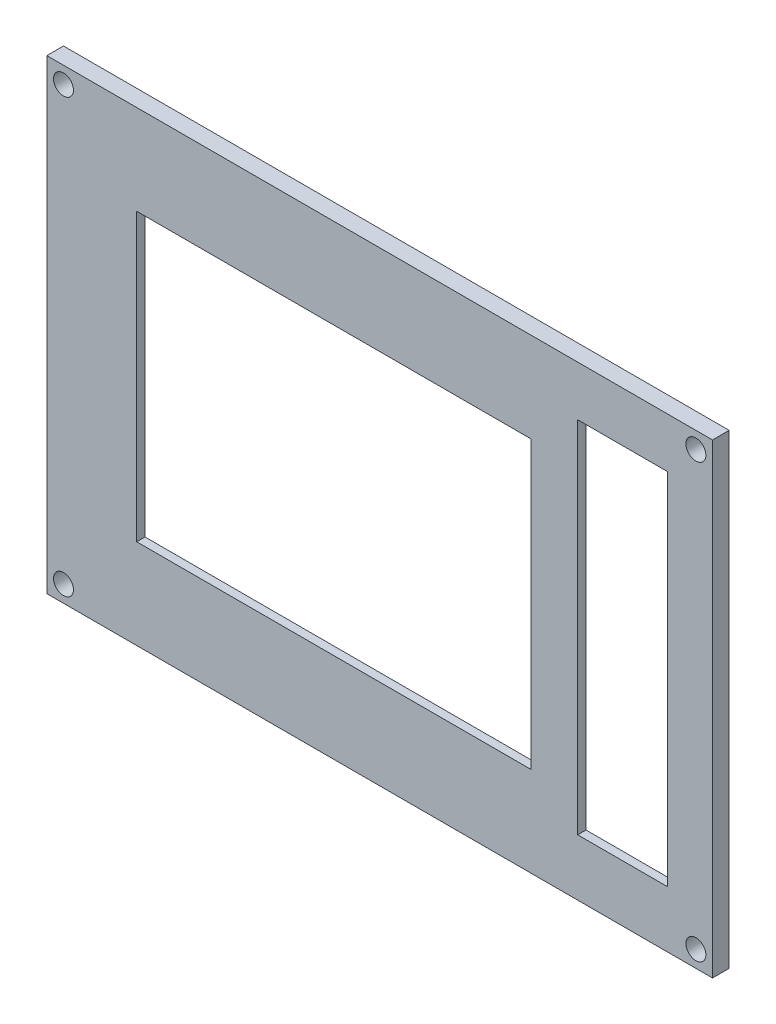
ISO-10303-21;
HEADER;
FILE_DESCRIPTION(('STEP AP214'),'2;1');
FILE_NAME('part.step','',(''),(''),'','','');
FILE_SCHEMA(('AUTOMOTIVE_DESIGN { 1 0 10303 214 1 1 1 1 }'));
ENDSEC;
DATA;
#1=APPLICATION_CONTEXT('core data for automotive mechanical design processes');
#2=APPLICATION_PROTOCOL_DEFINITION('international standard','automotive_design',2000,#1);
#3=PRODUCT_CONTEXT('',#1,'mechanical');
#4=PRODUCT('Part','Part','',(#3));
#5=PRODUCT_RELATED_PRODUCT_CATEGORY('part','',(#4));
#6=PRODUCT_DEFINITION_FORMATION('','',#4);
#7=PRODUCT_DEFINITION_CONTEXT('part definition',#1,'design');
#8=PRODUCT_DEFINITION('design','',#6,#7);
#9=PRODUCT_DEFINITION_SHAPE('','',#8);
#10=(LENGTH_UNIT() NAMED_UNIT(*) SI_UNIT(.MILLI.,.METRE.));
#11=(NAMED_UNIT(*) PLANE_ANGLE_UNIT() SI_UNIT($,.RADIAN.));
#12=(NAMED_UNIT(*) SI_UNIT($,.STERADIAN.) SOLID_ANGLE_UNIT());
#13=UNCERTAINTY_MEASURE_WITH_UNIT(LENGTH_MEASURE(1.E-05),#10,'distance_accuracy_value','');
#14=(GEOMETRIC_REPRESENTATION_CONTEXT(3) GLOBAL_UNCERTAINTY_ASSIGNED_CONTEXT((#13)) GLOBAL_UNIT_ASSIGNED_CONTEXT((#10,
#11,#12)) REPRESENTATION_CONTEXT('',''));
#15=CARTESIAN_POINT('',(0.,0.,0.));
#16=DIRECTION('',(0.,0.,1.));
#17=DIRECTION('',(1.,0.,0.));
#18=AXIS2_PLACEMENT_3D('',#15,#16,#17);
#19=CARTESIAN_POINT('',(0.,51.5,-1.25));
#20=DIRECTION('',(0.,-1.,0.));
#21=DIRECTION('',(0.,0.,-1.));
#22=AXIS2_PLACEMENT_3D('',#19,#20,#21);
#23=PLANE('',#22);
#24=DIRECTION('',(1.,0.,0.));
#25=VECTOR('',#24,1.);
#26=CARTESIAN_POINT('',(0.,51.5,0.));
#27=LINE('',#26,#25);
#28=CARTESIAN_POINT('',(8.5,51.5,0.));
#29=VERTEX_POINT('',#28);
#30=CARTESIAN_POINT('',(67.75,51.5,0.));
#31=VERTEX_POINT('',#30);
#32=EDGE_CURVE('E158',#29,#31,#27,.T.);
#33=ORIENTED_EDGE('',*,*,#32,.F.);
#34=DIRECTION('',(0.,0.,1.));
#35=VECTOR('',#34,1.);
#36=CARTESIAN_POINT('',(8.5,51.5,-1.25));
#37=LINE('',#36,#35);
#38=CARTESIAN_POINT('',(8.5,51.5,-1.25));
#39=VERTEX_POINT('',#38);
#40=EDGE_CURVE('E11',#39,#29,#37,.T.);
#41=ORIENTED_EDGE('',*,*,#40,.F.);
#42=DIRECTION('',(1.,0.,0.));
#43=VECTOR('',#42,1.);
#44=CARTESIAN_POINT('',(0.,51.5,-1.25));
#45=LINE('',#44,#43);
#46=CARTESIAN_POINT('',(67.75,51.5,-1.25));
#47=VERTEX_POINT('',#46);
#48=EDGE_CURVE('E139',#39,#47,#45,.T.);
#49=ORIENTED_EDGE('',*,*,#48,.T.);
#50=DIRECTION('',(0.,0.,1.));
#51=VECTOR('',#50,1.);
#52=CARTESIAN_POINT('',(67.75,51.5,-1.25));
#53=LINE('',#52,#51);
#54=EDGE_CURVE('E136',#47,#31,#53,.T.);
#55=ORIENTED_EDGE('',*,*,#54,.T.);
#56=EDGE_LOOP('',(#33,#41,#49,#55));
#57=FACE_BOUND('',#56,.T.);
#58=ADVANCED_FACE('F35',(#57),#23,.T.);
#59=CARTESIAN_POINT('',(8.50000000000001,0.,-1.25));
#60=DIRECTION('',(-1.,0.,0.));
#61=DIRECTION('',(0.,-1.,0.));
#62=AXIS2_PLACEMENT_3D('',#59,#60,#61);
#63=PLANE('',#62);
#64=DIRECTION('',(0.,-1.,0.));
#65=VECTOR('',#64,1.);
#66=CARTESIAN_POINT('',(8.50000000000001,0.,0.));
#67=LINE('',#66,#65);
#68=CARTESIAN_POINT('',(8.50000000000001,8.5,0.));
#69=VERTEX_POINT('',#68);
#70=EDGE_CURVE('E164',#29,#69,#67,.T.);
#71=ORIENTED_EDGE('',*,*,#70,.T.);
#72=DIRECTION('',(0.,0.,1.));
#73=VECTOR('',#72,1.);
#74=CARTESIAN_POINT('',(8.50000000000001,8.5,-1.25));
#75=LINE('',#74,#73);
#76=CARTESIAN_POINT('',(8.50000000000001,8.5,-1.25));
#77=VERTEX_POINT('',#76);
#78=EDGE_CURVE('E45',#77,#69,#75,.T.);
#79=ORIENTED_EDGE('',*,*,#78,.F.);
#80=DIRECTION('',(0.,-1.,0.));
#81=VECTOR('',#80,1.);
#82=CARTESIAN_POINT('',(8.50000000000001,0.,-1.25));
#83=LINE('',#82,#81);
#84=EDGE_CURVE('E128',#39,#77,#83,.T.);
#85=ORIENTED_EDGE('',*,*,#84,.F.);
#86=ORIENTED_EDGE('',*,*,#40,.T.);
#87=EDGE_LOOP('',(#71,#79,#85,#86));
#88=FACE_BOUND('',#87,.T.);
#89=ADVANCED_FACE('F247',(#88),#63,.F.);
#90=CARTESIAN_POINT('',(0.,8.5,-1.25));
#91=DIRECTION('',(0.,-1.,0.));
#92=DIRECTION('',(0.,0.,-1.));
#93=AXIS2_PLACEMENT_3D('',#90,#91,#92);
#94=PLANE('',#93);
#95=DIRECTION('',(1.,0.,0.));
#96=VECTOR('',#95,1.);
#97=CARTESIAN_POINT('',(0.,8.5,0.));
#98=LINE('',#97,#96);
#99=CARTESIAN_POINT('',(67.75,8.5,0.));
#100=VERTEX_POINT('',#99);
#101=EDGE_CURVE('E83',#69,#100,#98,.T.);
#102=ORIENTED_EDGE('',*,*,#101,.T.);
#103=DIRECTION('',(0.,0.,1.));
#104=VECTOR('',#103,1.);
#105=CARTESIAN_POINT('',(67.75,8.5,-1.25));
#106=LINE('',#105,#104);
#107=CARTESIAN_POINT('',(67.75,8.5,-1.25));
#108=VERTEX_POINT('',#107);
#109=EDGE_CURVE('E132',#108,#100,#106,.T.);
#110=ORIENTED_EDGE('',*,*,#109,.F.);
#111=DIRECTION('',(1.,0.,0.));
#112=VECTOR('',#111,1.);
#113=CARTESIAN_POINT('',(0.,8.5,-1.25));
#114=LINE('',#113,#112);
#115=EDGE_CURVE('E122',#77,#108,#114,.T.);
#116=ORIENTED_EDGE('',*,*,#115,.F.);
#117=ORIENTED_EDGE('',*,*,#78,.T.);
#118=EDGE_LOOP('',(#102,#110,#116,#117));
#119=FACE_BOUND('',#118,.T.);
#120=ADVANCED_FACE('F133',(#119),#94,.F.);
#121=CARTESIAN_POINT('',(74.75,0.,-1.25));
#122=DIRECTION('',(-1.,0.,0.));
#123=DIRECTION('',(0.,-1.,0.));
#124=AXIS2_PLACEMENT_3D('',#121,#122,#123);
#125=PLANE('',#124);
#126=DIRECTION('',(0.,-1.,0.));
#127=VECTOR('',#126,1.);
#128=CARTESIAN_POINT('',(74.75,0.,0.));
#129=LINE('',#128,#127);
#130=CARTESIAN_POINT('',(74.75,57.5,0.));
#131=VERTEX_POINT('',#130);
#132=CARTESIAN_POINT('',(74.75,3.5,0.));
#133=VERTEX_POINT('',#132);
#134=EDGE_CURVE('E146',#131,#133,#129,.T.);
#135=ORIENTED_EDGE('',*,*,#134,.T.);
#136=DIRECTION('',(0.,0.,1.));
#137=VECTOR('',#136,1.);
#138=CARTESIAN_POINT('',(74.75,3.5,-1.25));
#139=LINE('',#138,#137);
#140=CARTESIAN_POINT('',(74.75,3.5,-1.25));
#141=VERTEX_POINT('',#140);
#142=EDGE_CURVE('E169',#141,#133,#139,.T.);
#143=ORIENTED_EDGE('',*,*,#142,.F.);
#144=DIRECTION('',(0.,-1.,0.));
#145=VECTOR('',#144,1.);
#146=CARTESIAN_POINT('',(74.75,0.,-1.25));
#147=LINE('',#146,#145);
#148=CARTESIAN_POINT('',(74.75,57.5,-1.25));
#149=VERTEX_POINT('',#148);
#150=EDGE_CURVE('E165',#149,#141,#147,.T.);
#151=ORIENTED_EDGE('',*,*,#150,.F.);
#152=DIRECTION('',(0.,0.,1.));
#153=VECTOR('',#152,1.);
#154=CARTESIAN_POINT('',(74.75,57.5,-1.25));
#155=LINE('',#154,#153);
#156=EDGE_CURVE('E39',#149,#131,#155,.T.);
#157=ORIENTED_EDGE('',*,*,#156,.T.);
#158=EDGE_LOOP('',(#135,#143,#151,#157));
#159=FACE_BOUND('',#158,.T.);
#160=ADVANCED_FACE('F37',(#159),#125,.F.);
#161=CARTESIAN_POINT('',(0.,3.49999999999999,-1.25));
#162=DIRECTION('',(0.,1.,0.));
#163=DIRECTION('',(-1.,0.,0.));
#164=AXIS2_PLACEMENT_3D('',#161,#162,#163);
#165=PLANE('',#164);
#166=DIRECTION('',(-1.,0.,0.));
#167=VECTOR('',#166,1.);
#168=CARTESIAN_POINT('',(0.,3.49999999999999,0.));
#169=LINE('',#168,#167);
#170=CARTESIAN_POINT('',(88.25,3.5,0.));
#171=VERTEX_POINT('',#170);
#172=EDGE_CURVE('E155',#171,#133,#169,.T.);
#173=ORIENTED_EDGE('',*,*,#172,.F.);
#174=DIRECTION('',(0.,0.,1.));
#175=VECTOR('',#174,1.);
#176=CARTESIAN_POINT('',(88.25,3.5,-1.25));
#177=LINE('',#176,#175);
#178=CARTESIAN_POINT('',(88.25,3.5,-1.25));
#179=VERTEX_POINT('',#178);
#180=EDGE_CURVE('E171',#179,#171,#177,.T.);
#181=ORIENTED_EDGE('',*,*,#180,.F.);
#182=DIRECTION('',(-1.,0.,0.));
#183=VECTOR('',#182,1.);
#184=CARTESIAN_POINT('',(0.,3.49999999999999,-1.25));
#185=LINE('',#184,#183);
#186=EDGE_CURVE('E189',#179,#141,#185,.T.);
#187=ORIENTED_EDGE('',*,*,#186,.T.);
#188=ORIENTED_EDGE('',*,*,#142,.T.);
#189=EDGE_LOOP('',(#173,#181,#187,#188));
#190=FACE_BOUND('',#189,.T.);
#191=ADVANCED_FACE('F185',(#190),#165,.T.);
#192=CARTESIAN_POINT('',(88.25,0.,-1.25));
#193=DIRECTION('',(-1.,0.,0.));
#194=DIRECTION('',(0.,0.,1.));
#195=AXIS2_PLACEMENT_3D('',#192,#193,#194);
#196=PLANE('',#195);
#197=DIRECTION('',(0.,-1.,0.));
#198=VECTOR('',#197,1.);
#199=CARTESIAN_POINT('',(88.25,0.,0.));
#200=LINE('',#199,#198);
#201=CARTESIAN_POINT('',(88.25,57.5,0.));
#202=VERTEX_POINT('',#201);
#203=EDGE_CURVE('E152',#202,#171,#200,.T.);
#204=ORIENTED_EDGE('',*,*,#203,.F.);
#205=DIRECTION('',(0.,0.,1.));
#206=VECTOR('',#205,1.);
#207=CARTESIAN_POINT('',(88.25,57.5,-1.25));
#208=LINE('',#207,#206);
#209=CARTESIAN_POINT('',(88.25,57.5,-1.25));
#210=VERTEX_POINT('',#209);
#211=EDGE_CURVE('E172',#210,#202,#208,.T.);
#212=ORIENTED_EDGE('',*,*,#211,.F.);
#213=DIRECTION('',(0.,-1.,0.));
#214=VECTOR('',#213,1.);
#215=CARTESIAN_POINT('',(88.25,0.,-1.25));
#216=LINE('',#215,#214);
#217=EDGE_CURVE('E191',#210,#179,#216,.T.);
#218=ORIENTED_EDGE('',*,*,#217,.T.);
#219=ORIENTED_EDGE('',*,*,#180,.T.);
#220=EDGE_LOOP('',(#204,#212,#218,#219));
#221=FACE_BOUND('',#220,.T.);
#222=ADVANCED_FACE('F257',(#221),#196,.T.);
#223=CARTESIAN_POINT('',(0.,57.5,-1.25));
#224=DIRECTION('',(0.,1.,0.));
#225=DIRECTION('',(0.,0.,1.));
#226=AXIS2_PLACEMENT_3D('',#223,#224,#225);
#227=PLANE('',#226);
#228=DIRECTION('',(-1.,0.,0.));
#229=VECTOR('',#228,1.);
#230=CARTESIAN_POINT('',(0.,57.5,0.));
#231=LINE('',#230,#229);
#232=EDGE_CURVE('E149',#202,#131,#231,.T.);
#233=ORIENTED_EDGE('',*,*,#232,.T.);
#234=ORIENTED_EDGE('',*,*,#156,.F.);
#235=DIRECTION('',(-1.,0.,0.));
#236=VECTOR('',#235,1.);
#237=CARTESIAN_POINT('',(0.,57.5,-1.25));
#238=LINE('',#237,#236);
#239=EDGE_CURVE('E95',#210,#149,#238,.T.);
#240=ORIENTED_EDGE('',*,*,#239,.F.);
#241=ORIENTED_EDGE('',*,*,#211,.T.);
#242=EDGE_LOOP('',(#233,#234,#240,#241));
#243=FACE_BOUND('',#242,.T.);
#244=ADVANCED_FACE('F243',(#243),#227,.F.);
#245=CARTESIAN_POINT('',(67.75,0.,-1.25));
#246=DIRECTION('',(-1.,0.,0.));
#247=DIRECTION('',(0.,0.,1.));
#248=AXIS2_PLACEMENT_3D('',#245,#246,#247);
#249=PLANE('',#248);
#250=DIRECTION('',(0.,-1.,0.));
#251=VECTOR('',#250,1.);
#252=CARTESIAN_POINT('',(67.75,0.,0.));
#253=LINE('',#252,#251);
#254=EDGE_CURVE('E161',#31,#100,#253,.T.);
#255=ORIENTED_EDGE('',*,*,#254,.F.);
#256=ORIENTED_EDGE('',*,*,#54,.F.);
#257=DIRECTION('',(0.,-1.,0.));
#258=VECTOR('',#257,1.);
#259=CARTESIAN_POINT('',(67.75,0.,-1.25));
#260=LINE('',#259,#258);
#261=EDGE_CURVE('E127',#47,#108,#260,.T.);
#262=ORIENTED_EDGE('',*,*,#261,.T.);
#263=ORIENTED_EDGE('',*,*,#109,.T.);
#264=EDGE_LOOP('',(#255,#256,#262,#263));
#265=FACE_BOUND('',#264,.T.);
#266=ADVANCED_FACE('F138',(#265),#249,.T.);
#267=CARTESIAN_POINT('',(0.,0.,-1.25));
#268=DIRECTION('',(0.,0.,1.));
#269=DIRECTION('',(1.,0.,0.));
#270=AXIS2_PLACEMENT_3D('',#267,#268,#269);
#271=PLANE('',#270);
#272=ORIENTED_EDGE('',*,*,#150,.T.);
#273=ORIENTED_EDGE('',*,*,#186,.F.);
#274=ORIENTED_EDGE('',*,*,#217,.F.);
#275=ORIENTED_EDGE('',*,*,#239,.T.);
#276=EDGE_LOOP('',(#272,#273,#274,#275));
#277=FACE_BOUND('',#276,.T.);
#278=DIRECTION('',(1.,0.,0.));
#279=VECTOR('',#278,1.);
#280=CARTESIAN_POINT('',(0.,0.,-1.25));
#281=LINE('',#280,#279);
#282=CARTESIAN_POINT('',(0.,0.,-1.25));
#283=VERTEX_POINT('',#282);
#284=CARTESIAN_POINT('',(90.,0.,-1.25));
#285=VERTEX_POINT('',#284);
#286=EDGE_CURVE('E190',#283,#285,#281,.T.);
#287=ORIENTED_EDGE('',*,*,#286,.F.);
#288=DIRECTION('',(0.,1.,0.));
#289=VECTOR('',#288,1.);
#290=CARTESIAN_POINT('',(0.,0.,-1.25));
#291=LINE('',#290,#289);
#292=CARTESIAN_POINT('',(0.,60.,-1.25));
#293=VERTEX_POINT('',#292);
#294=EDGE_CURVE('E141',#283,#293,#291,.T.);
#295=ORIENTED_EDGE('',*,*,#294,.T.);
#296=DIRECTION('',(1.,0.,0.));
#297=VECTOR('',#296,1.);
#298=CARTESIAN_POINT('',(0.,60.,-1.25));
#299=LINE('',#298,#297);
#300=CARTESIAN_POINT('',(90.,60.,-1.25));
#301=VERTEX_POINT('',#300);
#302=EDGE_CURVE('E201',#293,#301,#299,.T.);
#303=ORIENTED_EDGE('',*,*,#302,.T.);
#304=DIRECTION('',(0.,1.,0.));
#305=VECTOR('',#304,1.);
#306=CARTESIAN_POINT('',(90.,0.,-1.25));
#307=LINE('',#306,#305);
#308=EDGE_CURVE('E194',#285,#301,#307,.T.);
#309=ORIENTED_EDGE('',*,*,#308,.F.);
#310=EDGE_LOOP('',(#287,#295,#303,#309));
#311=FACE_BOUND('',#310,.T.);
#312=ORIENTED_EDGE('',*,*,#48,.F.);
#313=ORIENTED_EDGE('',*,*,#84,.T.);
#314=ORIENTED_EDGE('',*,*,#115,.T.);
#315=ORIENTED_EDGE('',*,*,#261,.F.);
#316=EDGE_LOOP('',(#312,#313,#314,#315));
#317=FACE_BOUND('',#316,.T.);
#318=ADVANCED_FACE('F125',(#277,#311,#317),#271,.F.);
#319=CARTESIAN_POINT('',(0.,0.,0.));
#320=DIRECTION('',(0.,0.,1.));
#321=DIRECTION('',(1.,0.,0.));
#322=AXIS2_PLACEMENT_3D('',#319,#320,#321);
#323=PLANE('',#322);
#324=ORIENTED_EDGE('',*,*,#134,.F.);
#325=ORIENTED_EDGE('',*,*,#232,.F.);
#326=ORIENTED_EDGE('',*,*,#203,.T.);
#327=ORIENTED_EDGE('',*,*,#172,.T.);
#328=EDGE_LOOP('',(#324,#325,#326,#327));
#329=FACE_BOUND('',#328,.T.);
#330=ORIENTED_EDGE('',*,*,#32,.T.);
#331=ORIENTED_EDGE('',*,*,#254,.T.);
#332=ORIENTED_EDGE('',*,*,#101,.F.);
#333=ORIENTED_EDGE('',*,*,#70,.F.);
#334=EDGE_LOOP('',(#330,#331,#332,#333));
#335=FACE_BOUND('',#334,.T.);
#336=CARTESIAN_POINT('',(92.5,-2.49999999999998,0.));
#337=DIRECTION('',(0.,0.,1.));
#338=DIRECTION('',(1.,0.,0.));
#339=AXIS2_PLACEMENT_3D('',#336,#337,#338);
#340=CIRCLE('',#339,1.5);
#341=CARTESIAN_POINT('',(94.,-2.49999999999998,0.));
#342=VERTEX_POINT('',#341);
#343=EDGE_CURVE('E455',#342,#342,#340,.T.);
#344=ORIENTED_EDGE('',*,*,#343,.F.);
#345=EDGE_LOOP('',(#344));
#346=FACE_BOUND('',#345,.T.);
#347=CARTESIAN_POINT('',(92.5,62.5,0.));
#348=DIRECTION('',(0.,0.,1.));
#349=DIRECTION('',(1.,0.,0.));
#350=AXIS2_PLACEMENT_3D('',#347,#348,#349);
#351=CIRCLE('',#350,1.5);
#352=CARTESIAN_POINT('',(94.,62.5,0.));
#353=VERTEX_POINT('',#352);
#354=EDGE_CURVE('E458',#353,#353,#351,.T.);
#355=ORIENTED_EDGE('',*,*,#354,.F.);
#356=EDGE_LOOP('',(#355));
#357=FACE_BOUND('',#356,.T.);
#358=CARTESIAN_POINT('',(-2.50000000000002,62.5,0.));
#359=DIRECTION('',(0.,0.,1.));
#360=DIRECTION('',(1.,0.,0.));
#361=AXIS2_PLACEMENT_3D('',#358,#359,#360);
#362=CIRCLE('',#361,1.5);
#363=CARTESIAN_POINT('',(-1.00000000000002,62.5,0.));
#364=VERTEX_POINT('',#363);
#365=EDGE_CURVE('E461',#364,#364,#362,.T.);
#366=ORIENTED_EDGE('',*,*,#365,.F.);
#367=EDGE_LOOP('',(#366));
#368=FACE_BOUND('',#367,.T.);
#369=CARTESIAN_POINT('',(-2.5,-2.5,0.));
#370=DIRECTION('',(0.,0.,1.));
#371=DIRECTION('',(1.,0.,0.));
#372=AXIS2_PLACEMENT_3D('',#369,#370,#371);
#373=CIRCLE('',#372,1.5);
#374=CARTESIAN_POINT('',(-1.,-2.5,0.));
#375=VERTEX_POINT('',#374);
#376=EDGE_CURVE('E464',#375,#375,#373,.T.);
#377=ORIENTED_EDGE('',*,*,#376,.F.);
#378=EDGE_LOOP('',(#377));
#379=FACE_BOUND('',#378,.T.);
#380=DIRECTION('',(1.,0.,0.));
#381=VECTOR('',#380,1.);
#382=CARTESIAN_POINT('',(0.,-5.,0.));
#383=LINE('',#382,#381);
#384=CARTESIAN_POINT('',(-5.,-5.,0.));
#385=VERTEX_POINT('',#384);
#386=CARTESIAN_POINT('',(95.,-4.99999999999998,0.));
#387=VERTEX_POINT('',#386);
#388=EDGE_CURVE('E467',#385,#387,#383,.T.);
#389=ORIENTED_EDGE('',*,*,#388,.T.);
#390=DIRECTION('',(0.,1.,0.));
#391=VECTOR('',#390,1.);
#392=CARTESIAN_POINT('',(95.,0.,0.));
#393=LINE('',#392,#391);
#394=CARTESIAN_POINT('',(95.,65.,0.));
#395=VERTEX_POINT('',#394);
#396=EDGE_CURVE('E470',#387,#395,#393,.T.);
#397=ORIENTED_EDGE('',*,*,#396,.T.);
#398=DIRECTION('',(1.,0.,0.));
#399=VECTOR('',#398,1.);
#400=CARTESIAN_POINT('',(0.,65.,0.));
#401=LINE('',#400,#399);
#402=CARTESIAN_POINT('',(-5.,65.,0.));
#403=VERTEX_POINT('',#402);
#404=EDGE_CURVE('E473',#403,#395,#401,.T.);
#405=ORIENTED_EDGE('',*,*,#404,.F.);
#406=DIRECTION('',(0.,1.,0.));
#407=VECTOR('',#406,1.);
#408=CARTESIAN_POINT('',(-5.,0.,0.));
#409=LINE('',#408,#407);
#410=EDGE_CURVE('E476',#385,#403,#409,.T.);
#411=ORIENTED_EDGE('',*,*,#410,.F.);
#412=EDGE_LOOP('',(#389,#397,#405,#411));
#413=FACE_BOUND('',#412,.T.);
#414=ADVANCED_FACE('F181',(#329,#335,#346,#357,#368,#379,#413),#323,.T.);
#415=CARTESIAN_POINT('',(90.,0.,-2.5));
#416=DIRECTION('',(1.,0.,0.));
#417=DIRECTION('',(0.,0.,-1.));
#418=AXIS2_PLACEMENT_3D('',#415,#416,#417);
#419=PLANE('',#418);
#420=DIRECTION('',(0.,0.,1.));
#421=VECTOR('',#420,1.);
#422=CARTESIAN_POINT('',(90.,0.,-2.5));
#423=LINE('',#422,#421);
#424=CARTESIAN_POINT('',(90.,0.,-2.5));
#425=VERTEX_POINT('',#424);
#426=EDGE_CURVE('E228',#425,#285,#423,.T.);
#427=ORIENTED_EDGE('',*,*,#426,.T.);
#428=ORIENTED_EDGE('',*,*,#308,.T.);
#429=DIRECTION('',(0.,0.,1.));
#430=VECTOR('',#429,1.);
#431=CARTESIAN_POINT('',(90.,60.,-2.5));
#432=LINE('',#431,#430);
#433=CARTESIAN_POINT('',(90.,60.,-2.5));
#434=VERTEX_POINT('',#433);
#435=EDGE_CURVE('E219',#434,#301,#432,.T.);
#436=ORIENTED_EDGE('',*,*,#435,.F.);
#437=DIRECTION('',(0.,1.,0.));
#438=VECTOR('',#437,1.);
#439=CARTESIAN_POINT('',(90.,0.,-2.5));
#440=LINE('',#439,#438);
#441=EDGE_CURVE('E429',#425,#434,#440,.T.);
#442=ORIENTED_EDGE('',*,*,#441,.F.);
#443=EDGE_LOOP('',(#427,#428,#436,#442));
#444=FACE_BOUND('',#443,.T.);
#445=ADVANCED_FACE('F241',(#444),#419,.F.);
#446=CARTESIAN_POINT('',(0.,60.,-2.5));
#447=DIRECTION('',(0.,-1.,0.));
#448=DIRECTION('',(0.,0.,-1.));
#449=AXIS2_PLACEMENT_3D('',#446,#447,#448);
#450=PLANE('',#449);
#451=ORIENTED_EDGE('',*,*,#302,.F.);
#452=DIRECTION('',(0.,0.,1.));
#453=VECTOR('',#452,1.);
#454=CARTESIAN_POINT('',(0.,60.,-2.5));
#455=LINE('',#454,#453);
#456=CARTESIAN_POINT('',(0.,60.,-2.5));
#457=VERTEX_POINT('',#456);
#458=EDGE_CURVE('E216',#457,#293,#455,.T.);
#459=ORIENTED_EDGE('',*,*,#458,.F.);
#460=DIRECTION('',(1.,0.,0.));
#461=VECTOR('',#460,1.);
#462=CARTESIAN_POINT('',(0.,60.,-2.5));
#463=LINE('',#462,#461);
#464=EDGE_CURVE('E446',#457,#434,#463,.T.);
#465=ORIENTED_EDGE('',*,*,#464,.T.);
#466=ORIENTED_EDGE('',*,*,#435,.T.);
#467=EDGE_LOOP('',(#451,#459,#465,#466));
#468=FACE_BOUND('',#467,.T.);
#469=ADVANCED_FACE('F213',(#468),#450,.T.);
#470=CARTESIAN_POINT('',(0.,0.,-2.5));
#471=DIRECTION('',(1.,0.,0.));
#472=DIRECTION('',(0.,0.,-1.));
#473=AXIS2_PLACEMENT_3D('',#470,#471,#472);
#474=PLANE('',#473);
#475=ORIENTED_EDGE('',*,*,#294,.F.);
#476=DIRECTION('',(0.,0.,1.));
#477=VECTOR('',#476,1.);
#478=CARTESIAN_POINT('',(0.,0.,-2.5));
#479=LINE('',#478,#477);
#480=CARTESIAN_POINT('',(0.,0.,-2.5));
#481=VERTEX_POINT('',#480);
#482=EDGE_CURVE('E224',#481,#283,#479,.T.);
#483=ORIENTED_EDGE('',*,*,#482,.F.);
#484=DIRECTION('',(0.,1.,0.));
#485=VECTOR('',#484,1.);
#486=CARTESIAN_POINT('',(0.,0.,-2.5));
#487=LINE('',#486,#485);
#488=EDGE_CURVE('E222',#481,#457,#487,.T.);
#489=ORIENTED_EDGE('',*,*,#488,.T.);
#490=ORIENTED_EDGE('',*,*,#458,.T.);
#491=EDGE_LOOP('',(#475,#483,#489,#490));
#492=FACE_BOUND('',#491,.T.);
#493=ADVANCED_FACE('F220',(#492),#474,.T.);
#494=CARTESIAN_POINT('',(0.,0.,-2.5));
#495=DIRECTION('',(0.,-1.,0.));
#496=DIRECTION('',(0.,0.,-1.));
#497=AXIS2_PLACEMENT_3D('',#494,#495,#496);
#498=PLANE('',#497);
#499=ORIENTED_EDGE('',*,*,#482,.T.);
#500=ORIENTED_EDGE('',*,*,#286,.T.);
#501=ORIENTED_EDGE('',*,*,#426,.F.);
#502=DIRECTION('',(1.,0.,0.));
#503=VECTOR('',#502,1.);
#504=CARTESIAN_POINT('',(0.,0.,-2.5));
#505=LINE('',#504,#503);
#506=EDGE_CURVE('E512',#481,#425,#505,.T.);
#507=ORIENTED_EDGE('',*,*,#506,.F.);
#508=EDGE_LOOP('',(#499,#500,#501,#507));
#509=FACE_BOUND('',#508,.T.);
#510=ADVANCED_FACE('F306',(#509),#498,.F.);
#511=CARTESIAN_POINT('',(0.,-5.,-2.5));
#512=DIRECTION('',(0.,-1.,0.));
#513=DIRECTION('',(1.,0.,0.));
#514=AXIS2_PLACEMENT_3D('',#511,#512,#513);
#515=PLANE('',#514);
#516=ORIENTED_EDGE('',*,*,#388,.F.);
#517=DIRECTION('',(0.,0.,1.));
#518=VECTOR('',#517,1.);
#519=CARTESIAN_POINT('',(-5.,-5.,-2.5));
#520=LINE('',#519,#518);
#521=CARTESIAN_POINT('',(-5.,-5.,-2.5));
#522=VERTEX_POINT('',#521);
#523=EDGE_CURVE('E150',#522,#385,#520,.T.);
#524=ORIENTED_EDGE('',*,*,#523,.F.);
#525=DIRECTION('',(1.,0.,0.));
#526=VECTOR('',#525,1.);
#527=CARTESIAN_POINT('',(0.,-5.,-2.5));
#528=LINE('',#527,#526);
#529=CARTESIAN_POINT('',(95.,-4.99999999999998,-2.5));
#530=VERTEX_POINT('',#529);
#531=EDGE_CURVE('E435',#522,#530,#528,.T.);
#532=ORIENTED_EDGE('',*,*,#531,.T.);
#533=DIRECTION('',(0.,0.,1.));
#534=VECTOR('',#533,1.);
#535=CARTESIAN_POINT('',(95.,-4.99999999999998,-2.5));
#536=LINE('',#535,#534);
#537=EDGE_CURVE('E226',#530,#387,#536,.T.);
#538=ORIENTED_EDGE('',*,*,#537,.T.);
#539=EDGE_LOOP('',(#516,#524,#532,#538));
#540=FACE_BOUND('',#539,.T.);
#541=ADVANCED_FACE('F315',(#540),#515,.T.);
#542=CARTESIAN_POINT('',(-5.,0.,-2.5));
#543=DIRECTION('',(1.,0.,0.));
#544=DIRECTION('',(0.,1.,0.));
#545=AXIS2_PLACEMENT_3D('',#542,#543,#544);
#546=PLANE('',#545);
#547=ORIENTED_EDGE('',*,*,#410,.T.);
#548=DIRECTION('',(0.,0.,1.));
#549=VECTOR('',#548,1.);
#550=CARTESIAN_POINT('',(-5.,65.,-2.5));
#551=LINE('',#550,#549);
#552=CARTESIAN_POINT('',(-5.,65.,-2.5));
#553=VERTEX_POINT('',#552);
#554=EDGE_CURVE('E481',#553,#403,#551,.T.);
#555=ORIENTED_EDGE('',*,*,#554,.F.);
#556=DIRECTION('',(0.,1.,0.));
#557=VECTOR('',#556,1.);
#558=CARTESIAN_POINT('',(-5.,0.,-2.5));
#559=LINE('',#558,#557);
#560=EDGE_CURVE('E234',#522,#553,#559,.T.);
#561=ORIENTED_EDGE('',*,*,#560,.F.);
#562=ORIENTED_EDGE('',*,*,#523,.T.);
#563=EDGE_LOOP('',(#547,#555,#561,#562));
#564=FACE_BOUND('',#563,.T.);
#565=ADVANCED_FACE('F325',(#564),#546,.F.);
#566=CARTESIAN_POINT('',(0.,65.,-2.5));
#567=DIRECTION('',(0.,-1.,0.));
#568=DIRECTION('',(1.,0.,0.));
#569=AXIS2_PLACEMENT_3D('',#566,#567,#568);
#570=PLANE('',#569);
#571=ORIENTED_EDGE('',*,*,#404,.T.);
#572=DIRECTION('',(0.,0.,1.));
#573=VECTOR('',#572,1.);
#574=CARTESIAN_POINT('',(95.,65.,-2.5));
#575=LINE('',#574,#573);
#576=CARTESIAN_POINT('',(95.,65.,-2.5));
#577=VERTEX_POINT('',#576);
#578=EDGE_CURVE('E484',#577,#395,#575,.T.);
#579=ORIENTED_EDGE('',*,*,#578,.F.);
#580=DIRECTION('',(1.,0.,0.));
#581=VECTOR('',#580,1.);
#582=CARTESIAN_POINT('',(0.,65.,-2.5));
#583=LINE('',#582,#581);
#584=EDGE_CURVE('E448',#553,#577,#583,.T.);
#585=ORIENTED_EDGE('',*,*,#584,.F.);
#586=ORIENTED_EDGE('',*,*,#554,.T.);
#587=EDGE_LOOP('',(#571,#579,#585,#586));
#588=FACE_BOUND('',#587,.T.);
#589=ADVANCED_FACE('F335',(#588),#570,.F.);
#590=CARTESIAN_POINT('',(-2.5,-2.5,-2.5));
#591=DIRECTION('',(0.,0.,1.));
#592=DIRECTION('',(1.,0.,0.));
#593=AXIS2_PLACEMENT_3D('',#590,#591,#592);
#594=CYLINDRICAL_SURFACE('',#593,1.5);
#595=CARTESIAN_POINT('',(-2.5,-2.5,-2.5));
#596=DIRECTION('',(0.,0.,1.));
#597=DIRECTION('',(1.,0.,0.));
#598=AXIS2_PLACEMENT_3D('',#595,#596,#597);
#599=CIRCLE('',#598,1.5);
#600=CARTESIAN_POINT('',(-1.,-2.5,-2.5));
#601=VERTEX_POINT('',#600);
#602=EDGE_CURVE('E423',#601,#601,#599,.T.);
#603=ORIENTED_EDGE('',*,*,#602,.F.);
#604=EDGE_LOOP('',(#603));
#605=FACE_BOUND('',#604,.T.);
#606=ORIENTED_EDGE('',*,*,#376,.T.);
#607=EDGE_LOOP('',(#606));
#608=FACE_BOUND('',#607,.T.);
#609=ADVANCED_FACE('F345',(#605,#608),#594,.F.);
#610=CARTESIAN_POINT('',(-2.50000000000002,62.5,-2.5));
#611=DIRECTION('',(0.,0.,1.));
#612=DIRECTION('',(1.,0.,0.));
#613=AXIS2_PLACEMENT_3D('',#610,#611,#612);
#614=CYLINDRICAL_SURFACE('',#613,1.5);
#615=CARTESIAN_POINT('',(-2.50000000000002,62.5,-2.5));
#616=DIRECTION('',(0.,0.,1.));
#617=DIRECTION('',(1.,0.,0.));
#618=AXIS2_PLACEMENT_3D('',#615,#616,#617);
#619=CIRCLE('',#618,1.5);
#620=CARTESIAN_POINT('',(-1.00000000000002,62.5,-2.5));
#621=VERTEX_POINT('',#620);
#622=EDGE_CURVE('E419',#621,#621,#619,.T.);
#623=ORIENTED_EDGE('',*,*,#622,.F.);
#624=EDGE_LOOP('',(#623));
#625=FACE_BOUND('',#624,.T.);
#626=ORIENTED_EDGE('',*,*,#365,.T.);
#627=EDGE_LOOP('',(#626));
#628=FACE_BOUND('',#627,.T.);
#629=ADVANCED_FACE('F355',(#625,#628),#614,.F.);
#630=CARTESIAN_POINT('',(92.5,62.5,-2.5));
#631=DIRECTION('',(0.,0.,1.));
#632=DIRECTION('',(1.,0.,0.));
#633=AXIS2_PLACEMENT_3D('',#630,#631,#632);
#634=CYLINDRICAL_SURFACE('',#633,1.5);
#635=CARTESIAN_POINT('',(92.5,62.5,-2.5));
#636=DIRECTION('',(0.,0.,1.));
#637=DIRECTION('',(1.,0.,0.));
#638=AXIS2_PLACEMENT_3D('',#635,#636,#637);
#639=CIRCLE('',#638,1.5);
#640=CARTESIAN_POINT('',(94.,62.5,-2.5));
#641=VERTEX_POINT('',#640);
#642=EDGE_CURVE('E415',#641,#641,#639,.T.);
#643=ORIENTED_EDGE('',*,*,#642,.F.);
#644=EDGE_LOOP('',(#643));
#645=FACE_BOUND('',#644,.T.);
#646=ORIENTED_EDGE('',*,*,#354,.T.);
#647=EDGE_LOOP('',(#646));
#648=FACE_BOUND('',#647,.T.);
#649=ADVANCED_FACE('F365',(#645,#648),#634,.F.);
#650=CARTESIAN_POINT('',(92.5,-2.49999999999998,-2.5));
#651=DIRECTION('',(0.,0.,1.));
#652=DIRECTION('',(1.,0.,0.));
#653=AXIS2_PLACEMENT_3D('',#650,#651,#652);
#654=CYLINDRICAL_SURFACE('',#653,1.5);
#655=CARTESIAN_POINT('',(92.5,-2.49999999999998,-2.5));
#656=DIRECTION('',(0.,0.,1.));
#657=DIRECTION('',(1.,0.,0.));
#658=AXIS2_PLACEMENT_3D('',#655,#656,#657);
#659=CIRCLE('',#658,1.5);
#660=CARTESIAN_POINT('',(94.,-2.49999999999998,-2.5));
#661=VERTEX_POINT('',#660);
#662=EDGE_CURVE('E411',#661,#661,#659,.T.);
#663=ORIENTED_EDGE('',*,*,#662,.F.);
#664=EDGE_LOOP('',(#663));
#665=FACE_BOUND('',#664,.T.);
#666=ORIENTED_EDGE('',*,*,#343,.T.);
#667=EDGE_LOOP('',(#666));
#668=FACE_BOUND('',#667,.T.);
#669=ADVANCED_FACE('F375',(#665,#668),#654,.F.);
#670=CARTESIAN_POINT('',(95.,0.,-2.5));
#671=DIRECTION('',(1.,0.,0.));
#672=DIRECTION('',(0.,1.,0.));
#673=AXIS2_PLACEMENT_3D('',#670,#671,#672);
#674=PLANE('',#673);
#675=ORIENTED_EDGE('',*,*,#396,.F.);
#676=ORIENTED_EDGE('',*,*,#537,.F.);
#677=DIRECTION('',(0.,1.,0.));
#678=VECTOR('',#677,1.);
#679=CARTESIAN_POINT('',(95.,0.,-2.5));
#680=LINE('',#679,#678);
#681=EDGE_CURVE('E442',#530,#577,#680,.T.);
#682=ORIENTED_EDGE('',*,*,#681,.T.);
#683=ORIENTED_EDGE('',*,*,#578,.T.);
#684=EDGE_LOOP('',(#675,#676,#682,#683));
#685=FACE_BOUND('',#684,.T.);
#686=ADVANCED_FACE('F385',(#685),#674,.T.);
#687=CARTESIAN_POINT('',(0.,0.,-2.5));
#688=DIRECTION('',(0.,0.,1.));
#689=DIRECTION('',(1.,0.,0.));
#690=AXIS2_PLACEMENT_3D('',#687,#688,#689);
#691=PLANE('',#690);
#692=ORIENTED_EDGE('',*,*,#662,.T.);
#693=EDGE_LOOP('',(#692));
#694=FACE_BOUND('',#693,.T.);
#695=ORIENTED_EDGE('',*,*,#642,.T.);
#696=EDGE_LOOP('',(#695));
#697=FACE_BOUND('',#696,.T.);
#698=ORIENTED_EDGE('',*,*,#622,.T.);
#699=EDGE_LOOP('',(#698));
#700=FACE_BOUND('',#699,.T.);
#701=ORIENTED_EDGE('',*,*,#602,.T.);
#702=EDGE_LOOP('',(#701));
#703=FACE_BOUND('',#702,.T.);
#704=ORIENTED_EDGE('',*,*,#441,.T.);
#705=ORIENTED_EDGE('',*,*,#464,.F.);
#706=ORIENTED_EDGE('',*,*,#488,.F.);
#707=ORIENTED_EDGE('',*,*,#506,.T.);
#708=EDGE_LOOP('',(#704,#705,#706,#707));
#709=FACE_BOUND('',#708,.T.);
#710=ORIENTED_EDGE('',*,*,#531,.F.);
#711=ORIENTED_EDGE('',*,*,#560,.T.);
#712=ORIENTED_EDGE('',*,*,#584,.T.);
#713=ORIENTED_EDGE('',*,*,#681,.F.);
#714=EDGE_LOOP('',(#710,#711,#712,#713));
#715=FACE_BOUND('',#714,.T.);
#716=ADVANCED_FACE('F394',(#694,#697,#700,#703,#709,#715),#691,.F.);
#717=CLOSED_SHELL('',(#58,#89,#120,#160,#191,#222,#244,#266,#318,#414,#445,#469,#493,#510,#541,
#565,#589,#609,#629,#649,#669,#686,#716));
#718=MANIFOLD_SOLID_BREP('B2',#717);
#719=ADVANCED_BREP_SHAPE_REPRESENTATION('',(#18,#718),#14);
#720=SHAPE_DEFINITION_REPRESENTATION(#9,#719);
ENDSEC;
END-ISO-10303-21;
